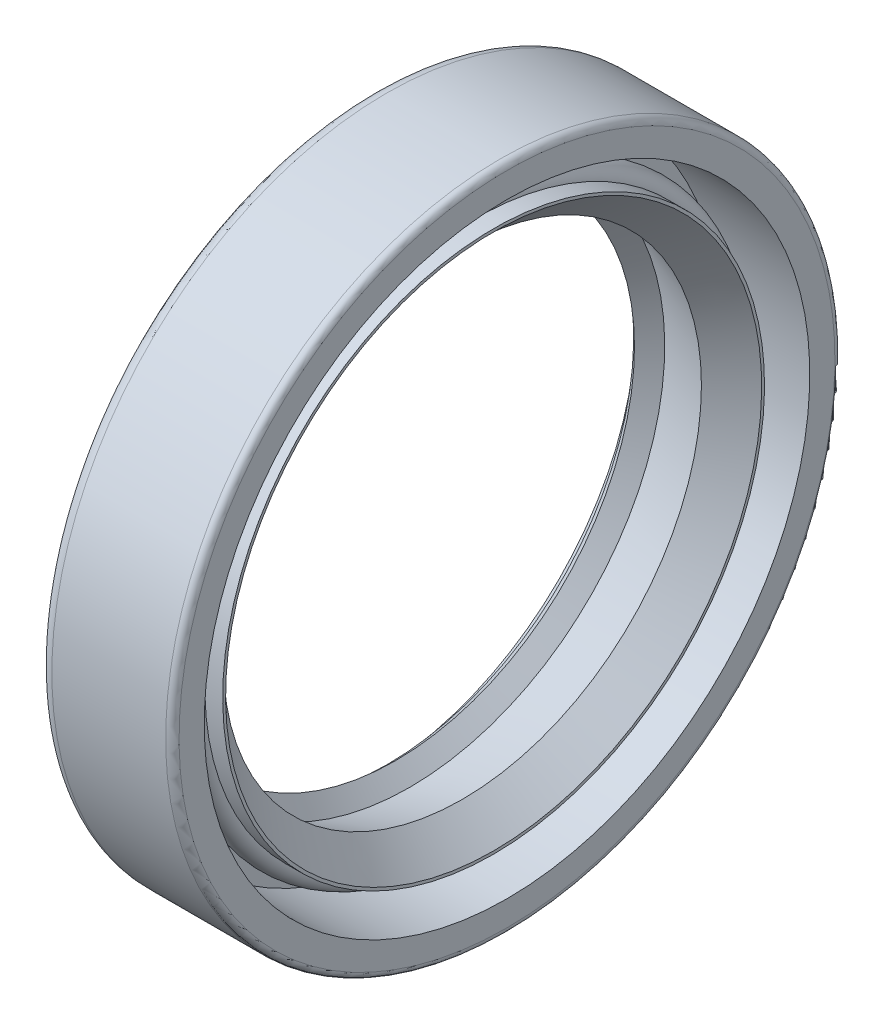
ISO-10303-21;
HEADER;
FILE_DESCRIPTION(('STEP AP214'),'2;1');
FILE_NAME('part.step','',(''),(''),'','','');
FILE_SCHEMA(('AUTOMOTIVE_DESIGN { 1 0 10303 214 1 1 1 1 }'));
ENDSEC;
DATA;
#1=APPLICATION_CONTEXT('core data for automotive mechanical design processes');
#2=APPLICATION_PROTOCOL_DEFINITION('international standard','automotive_design',2000,#1);
#3=PRODUCT_CONTEXT('',#1,'mechanical');
#4=PRODUCT('Part','Part','',(#3));
#5=PRODUCT_RELATED_PRODUCT_CATEGORY('part','',(#4));
#6=PRODUCT_DEFINITION_FORMATION('','',#4);
#7=PRODUCT_DEFINITION_CONTEXT('part definition',#1,'design');
#8=PRODUCT_DEFINITION('design','',#6,#7);
#9=PRODUCT_DEFINITION_SHAPE('','',#8);
#10=(LENGTH_UNIT() NAMED_UNIT(*) SI_UNIT(.MILLI.,.METRE.));
#11=(NAMED_UNIT(*) PLANE_ANGLE_UNIT() SI_UNIT($,.RADIAN.));
#12=(NAMED_UNIT(*) SI_UNIT($,.STERADIAN.) SOLID_ANGLE_UNIT());
#13=UNCERTAINTY_MEASURE_WITH_UNIT(LENGTH_MEASURE(1.E-05),#10,'distance_accuracy_value','');
#14=(GEOMETRIC_REPRESENTATION_CONTEXT(3) GLOBAL_UNCERTAINTY_ASSIGNED_CONTEXT((#13)) GLOBAL_UNIT_ASSIGNED_CONTEXT((#10,
#11,#12)) REPRESENTATION_CONTEXT('',''));
#15=CARTESIAN_POINT('',(0.,0.,0.));
#16=DIRECTION('',(0.,0.,1.));
#17=DIRECTION('',(1.,0.,0.));
#18=AXIS2_PLACEMENT_3D('',#15,#16,#17);
#19=CARTESIAN_POINT('',(4.66666666666667,0.,0.));
#20=DIRECTION('',(-1.,0.,0.));
#21=DIRECTION('',(0.,0.,1.));
#22=AXIS2_PLACEMENT_3D('',#19,#20,#21);
#23=TOROIDAL_SURFACE('',#22,14.1666666666667,0.7);
#24=CARTESIAN_POINT('',(4.66666666666667,0.,14.8666666666667));
#25=VERTEX_POINT('',#24);
#26=VERTEX_LOOP('',#25);
#27=FACE_BOUND('',#26,.T.);
#28=ADVANCED_FACE('F36',(#27),#23,.T.);
#29=CLOSED_SHELL('',(#28));
#30=MANIFOLD_SOLID_BREP('B2',#29);
#31=CARTESIAN_POINT('',(0.,16.8,0.));
#32=DIRECTION('',(1.,0.,0.));
#33=DIRECTION('',(0.,1.,0.));
#34=AXIS2_PLACEMENT_3D('',#31,#32,#33);
#35=PLANE('',#34);
#36=CARTESIAN_POINT('',(0.,0.,0.));
#37=DIRECTION('',(-1.,0.,0.));
#38=DIRECTION('',(0.,-1.,0.));
#39=AXIS2_PLACEMENT_3D('',#36,#37,#38);
#40=CIRCLE('',#39,15.8333333333333);
#41=CARTESIAN_POINT('',(0.,-15.8333333333333,0.));
#42=VERTEX_POINT('',#41);
#43=EDGE_CURVE('E35',#42,#42,#40,.T.);
#44=ORIENTED_EDGE('',*,*,#43,.F.);
#45=EDGE_LOOP('',(#44));
#46=FACE_BOUND('',#45,.T.);
#47=CARTESIAN_POINT('',(0.,0.,0.));
#48=DIRECTION('',(-1.,0.,0.));
#49=DIRECTION('',(0.,-1.,0.));
#50=AXIS2_PLACEMENT_3D('',#47,#48,#49);
#51=CIRCLE('',#50,16.8);
#52=CARTESIAN_POINT('',(0.,-16.8,0.));
#53=VERTEX_POINT('',#52);
#54=EDGE_CURVE('E118',#53,#53,#51,.T.);
#55=ORIENTED_EDGE('',*,*,#54,.T.);
#56=EDGE_LOOP('',(#55));
#57=FACE_BOUND('',#56,.T.);
#58=ADVANCED_FACE('F48',(#46,#57),#35,.F.);
#59=CARTESIAN_POINT('',(7.,0.,0.));
#60=DIRECTION('',(-1.,0.,0.));
#61=DIRECTION('',(0.,-1.,0.));
#62=AXIS2_PLACEMENT_3D('',#59,#60,#61);
#63=CYLINDRICAL_SURFACE('',#62,15.8333333333333);
#64=CARTESIAN_POINT('',(0.21875,0.,0.));
#65=DIRECTION('',(-1.,0.,0.));
#66=DIRECTION('',(0.,-1.,0.));
#67=AXIS2_PLACEMENT_3D('',#64,#65,#66);
#68=CIRCLE('',#67,15.8333333333333);
#69=CARTESIAN_POINT('',(0.21875,-15.8333333333333,0.));
#70=VERTEX_POINT('',#69);
#71=EDGE_CURVE('E54',#70,#70,#68,.T.);
#72=ORIENTED_EDGE('',*,*,#71,.F.);
#73=EDGE_LOOP('',(#72));
#74=FACE_BOUND('',#73,.T.);
#75=ORIENTED_EDGE('',*,*,#43,.T.);
#76=EDGE_LOOP('',(#75));
#77=FACE_BOUND('',#76,.T.);
#78=ADVANCED_FACE('F239',(#74,#77),#63,.F.);
#79=CARTESIAN_POINT('',(0.21875,15.8333333333333,0.));
#80=DIRECTION('',(1.,0.,0.));
#81=DIRECTION('',(0.,1.,0.));
#82=AXIS2_PLACEMENT_3D('',#79,#80,#81);
#83=PLANE('',#82);
#84=CARTESIAN_POINT('',(0.21875,0.,0.));
#85=DIRECTION('',(-1.,0.,0.));
#86=DIRECTION('',(0.,-1.,0.));
#87=AXIS2_PLACEMENT_3D('',#84,#85,#86);
#88=CIRCLE('',#87,14.1666666666667);
#89=CARTESIAN_POINT('',(0.21875,-14.1666666666667,0.));
#90=VERTEX_POINT('',#89);
#91=EDGE_CURVE('E58',#90,#90,#88,.T.);
#92=ORIENTED_EDGE('',*,*,#91,.F.);
#93=EDGE_LOOP('',(#92));
#94=FACE_BOUND('',#93,.T.);
#95=ORIENTED_EDGE('',*,*,#71,.T.);
#96=EDGE_LOOP('',(#95));
#97=FACE_BOUND('',#96,.T.);
#98=ADVANCED_FACE('F234',(#94,#97),#83,.F.);
#99=CARTESIAN_POINT('',(7.,0.,0.));
#100=DIRECTION('',(-1.,0.,0.));
#101=DIRECTION('',(0.,-1.,0.));
#102=AXIS2_PLACEMENT_3D('',#99,#100,#101);
#103=CYLINDRICAL_SURFACE('',#102,14.1666666666667);
#104=CARTESIAN_POINT('',(0.,0.,0.));
#105=DIRECTION('',(-1.,0.,0.));
#106=DIRECTION('',(0.,-1.,0.));
#107=AXIS2_PLACEMENT_3D('',#104,#105,#106);
#108=CIRCLE('',#107,14.1666666666667);
#109=CARTESIAN_POINT('',(0.,-14.1666666666667,0.));
#110=VERTEX_POINT('',#109);
#111=EDGE_CURVE('E62',#110,#110,#108,.T.);
#112=ORIENTED_EDGE('',*,*,#111,.F.);
#113=EDGE_LOOP('',(#112));
#114=FACE_BOUND('',#113,.T.);
#115=ORIENTED_EDGE('',*,*,#91,.T.);
#116=EDGE_LOOP('',(#115));
#117=FACE_BOUND('',#116,.T.);
#118=ADVANCED_FACE('F228',(#114,#117),#103,.T.);
#119=CARTESIAN_POINT('',(0.,14.1666666666667,0.));
#120=DIRECTION('',(1.,0.,0.));
#121=DIRECTION('',(0.,1.,0.));
#122=AXIS2_PLACEMENT_3D('',#119,#120,#121);
#123=PLANE('',#122);
#124=CARTESIAN_POINT('',(0.,0.,0.));
#125=DIRECTION('',(-1.,0.,0.));
#126=DIRECTION('',(0.,-1.,0.));
#127=AXIS2_PLACEMENT_3D('',#124,#125,#126);
#128=CIRCLE('',#127,13.75);
#129=CARTESIAN_POINT('',(0.,-13.75,0.));
#130=VERTEX_POINT('',#129);
#131=EDGE_CURVE('E67',#130,#130,#128,.T.);
#132=ORIENTED_EDGE('',*,*,#131,.F.);
#133=EDGE_LOOP('',(#132));
#134=FACE_BOUND('',#133,.T.);
#135=ORIENTED_EDGE('',*,*,#111,.T.);
#136=EDGE_LOOP('',(#135));
#137=FACE_BOUND('',#136,.T.);
#138=ADVANCED_FACE('F222',(#134,#137),#123,.F.);
#139=CARTESIAN_POINT('',(0.,0.,0.));
#140=DIRECTION('',(-1.,0.,0.));
#141=DIRECTION('',(0.,-1.,0.));
#142=AXIS2_PLACEMENT_3D('',#139,#140,#141);
#143=CONICAL_SURFACE('',#142,13.75,0.343023940420703);
#144=CARTESIAN_POINT('',(1.16666666666667,0.,0.));
#145=DIRECTION('',(-1.,0.,0.));
#146=DIRECTION('',(0.,-1.,0.));
#147=AXIS2_PLACEMENT_3D('',#144,#145,#146);
#148=CIRCLE('',#147,13.3333333333333);
#149=CARTESIAN_POINT('',(1.16666666666667,-13.3333333333333,0.));
#150=VERTEX_POINT('',#149);
#151=EDGE_CURVE('E70',#150,#150,#148,.T.);
#152=ORIENTED_EDGE('',*,*,#151,.F.);
#153=EDGE_LOOP('',(#152));
#154=FACE_BOUND('',#153,.T.);
#155=ORIENTED_EDGE('',*,*,#131,.T.);
#156=EDGE_LOOP('',(#155));
#157=FACE_BOUND('',#156,.T.);
#158=ADVANCED_FACE('F216',(#154,#157),#143,.F.);
#159=CARTESIAN_POINT('',(1.16666666666667,0.,0.));
#160=DIRECTION('',(1.,0.,0.));
#161=DIRECTION('',(0.,1.,0.));
#162=AXIS2_PLACEMENT_3D('',#159,#160,#161);
#163=CONICAL_SURFACE('',#162,13.3333333333333,0.840024322251901);
#164=CARTESIAN_POINT('',(0.752484208576877,0.,0.));
#165=DIRECTION('',(-1.,0.,0.));
#166=DIRECTION('',(0.,-1.,0.));
#167=AXIS2_PLACEMENT_3D('',#164,#165,#166);
#168=CIRCLE('',#167,12.8712353721462);
#169=CARTESIAN_POINT('',(0.752484208576877,-12.8712353721462,0.));
#170=VERTEX_POINT('',#169);
#171=EDGE_CURVE('E73',#170,#170,#168,.T.);
#172=ORIENTED_EDGE('',*,*,#171,.F.);
#173=EDGE_LOOP('',(#172));
#174=FACE_BOUND('',#173,.T.);
#175=ORIENTED_EDGE('',*,*,#151,.T.);
#176=EDGE_LOOP('',(#175));
#177=FACE_BOUND('',#176,.T.);
#178=ADVANCED_FACE('F210',(#174,#177),#163,.T.);
#179=CARTESIAN_POINT('',(0.752484208576877,0.,0.));
#180=DIRECTION('',(-1.,0.,0.));
#181=DIRECTION('',(0.,-1.,0.));
#182=AXIS2_PLACEMENT_3D('',#179,#180,#181);
#183=CONICAL_SURFACE('',#182,12.8712353721462,0.730772004542997);
#184=CARTESIAN_POINT('',(1.16666666666667,0.,0.));
#185=DIRECTION('',(-1.,0.,0.));
#186=DIRECTION('',(0.,-1.,0.));
#187=AXIS2_PLACEMENT_3D('',#184,#185,#186);
#188=CIRCLE('',#187,12.5);
#189=CARTESIAN_POINT('',(1.16666666666667,-12.5,0.));
#190=VERTEX_POINT('',#189);
#191=EDGE_CURVE('E76',#190,#190,#188,.T.);
#192=ORIENTED_EDGE('',*,*,#191,.F.);
#193=EDGE_LOOP('',(#192));
#194=FACE_BOUND('',#193,.T.);
#195=ORIENTED_EDGE('',*,*,#171,.T.);
#196=EDGE_LOOP('',(#195));
#197=FACE_BOUND('',#196,.T.);
#198=ADVANCED_FACE('F204',(#194,#197),#183,.F.);
#199=CARTESIAN_POINT('',(1.16666666666667,0.,0.));
#200=DIRECTION('',(1.,0.,0.));
#201=DIRECTION('',(0.,1.,0.));
#202=AXIS2_PLACEMENT_3D('',#199,#200,#201);
#203=CONICAL_SURFACE('',#202,12.5,0.840024322251901);
#204=CARTESIAN_POINT('',(1.91359064685784,0.,0.));
#205=DIRECTION('',(-1.,0.,0.));
#206=DIRECTION('',(0.,-1.,0.));
#207=AXIS2_PLACEMENT_3D('',#204,#205,#206);
#208=CIRCLE('',#207,13.3333333333333);
#209=CARTESIAN_POINT('',(1.91359064685784,-13.3333333333333,0.));
#210=VERTEX_POINT('',#209);
#211=EDGE_CURVE('E79',#210,#210,#208,.T.);
#212=ORIENTED_EDGE('',*,*,#211,.F.);
#213=EDGE_LOOP('',(#212));
#214=FACE_BOUND('',#213,.T.);
#215=ORIENTED_EDGE('',*,*,#191,.T.);
#216=EDGE_LOOP('',(#215));
#217=FACE_BOUND('',#216,.T.);
#218=ADVANCED_FACE('F198',(#214,#217),#203,.F.);
#219=CARTESIAN_POINT('',(1.91359064685784,0.,0.));
#220=DIRECTION('',(-1.,0.,0.));
#221=DIRECTION('',(0.,-1.,0.));
#222=AXIS2_PLACEMENT_3D('',#219,#220,#221);
#223=CONICAL_SURFACE('',#222,13.3333333333333,0.293924435090451);
#224=CARTESIAN_POINT('',(4.66666666666667,0.,0.));
#225=DIRECTION('',(-1.,0.,0.));
#226=DIRECTION('',(0.,-1.,0.));
#227=AXIS2_PLACEMENT_3D('',#224,#225,#226);
#228=CIRCLE('',#227,12.5);
#229=CARTESIAN_POINT('',(4.66666666666667,-12.5,0.));
#230=VERTEX_POINT('',#229);
#231=EDGE_CURVE('E82',#230,#230,#228,.T.);
#232=ORIENTED_EDGE('',*,*,#231,.F.);
#233=EDGE_LOOP('',(#232));
#234=FACE_BOUND('',#233,.T.);
#235=ORIENTED_EDGE('',*,*,#211,.T.);
#236=EDGE_LOOP('',(#235));
#237=FACE_BOUND('',#236,.T.);
#238=ADVANCED_FACE('F192',(#234,#237),#223,.F.);
#239=CARTESIAN_POINT('',(4.66666666666667,0.,0.));
#240=DIRECTION('',(1.,0.,0.));
#241=DIRECTION('',(0.,1.,0.));
#242=AXIS2_PLACEMENT_3D('',#239,#240,#241);
#243=CONICAL_SURFACE('',#242,12.5,0.748378047523382);
#244=CARTESIAN_POINT('',(6.3,0.,0.));
#245=DIRECTION('',(-1.,0.,0.));
#246=DIRECTION('',(0.,-1.,0.));
#247=AXIS2_PLACEMENT_3D('',#244,#245,#246);
#248=CIRCLE('',#247,14.0166666666663);
#249=CARTESIAN_POINT('',(6.3,-14.0166666666663,0.));
#250=VERTEX_POINT('',#249);
#251=EDGE_CURVE('E85',#250,#250,#248,.T.);
#252=ORIENTED_EDGE('',*,*,#251,.F.);
#253=EDGE_LOOP('',(#252));
#254=FACE_BOUND('',#253,.T.);
#255=ORIENTED_EDGE('',*,*,#231,.T.);
#256=EDGE_LOOP('',(#255));
#257=FACE_BOUND('',#256,.T.);
#258=ADVANCED_FACE('F186',(#254,#257),#243,.F.);
#259=CARTESIAN_POINT('',(6.3,14.0166666666663,0.));
#260=DIRECTION('',(-1.,0.,0.));
#261=DIRECTION('',(0.,-1.,0.));
#262=AXIS2_PLACEMENT_3D('',#259,#260,#261);
#263=PLANE('',#262);
#264=CARTESIAN_POINT('',(6.3,0.,0.));
#265=DIRECTION('',(-1.,0.,0.));
#266=DIRECTION('',(0.,-1.,0.));
#267=AXIS2_PLACEMENT_3D('',#264,#265,#266);
#268=CIRCLE('',#267,14.1666666666667);
#269=CARTESIAN_POINT('',(6.3,-14.1666666666667,0.));
#270=VERTEX_POINT('',#269);
#271=EDGE_CURVE('E88',#270,#270,#268,.T.);
#272=ORIENTED_EDGE('',*,*,#271,.F.);
#273=EDGE_LOOP('',(#272));
#274=FACE_BOUND('',#273,.T.);
#275=ORIENTED_EDGE('',*,*,#251,.T.);
#276=EDGE_LOOP('',(#275));
#277=FACE_BOUND('',#276,.T.);
#278=ADVANCED_FACE('F180',(#274,#277),#263,.F.);
#279=CARTESIAN_POINT('',(7.,0.,0.));
#280=DIRECTION('',(-1.,0.,0.));
#281=DIRECTION('',(0.,-1.,0.));
#282=AXIS2_PLACEMENT_3D('',#279,#280,#281);
#283=CYLINDRICAL_SURFACE('',#282,14.1666666666667);
#284=CARTESIAN_POINT('',(5.36666666666667,0.,0.));
#285=DIRECTION('',(-1.,0.,0.));
#286=DIRECTION('',(0.,-1.,0.));
#287=AXIS2_PLACEMENT_3D('',#284,#285,#286);
#288=CIRCLE('',#287,14.1666666666667);
#289=CARTESIAN_POINT('',(5.36666666666667,-14.1666666666667,0.));
#290=VERTEX_POINT('',#289);
#291=EDGE_CURVE('E91',#290,#290,#288,.T.);
#292=ORIENTED_EDGE('',*,*,#291,.F.);
#293=EDGE_LOOP('',(#292));
#294=FACE_BOUND('',#293,.T.);
#295=ORIENTED_EDGE('',*,*,#271,.T.);
#296=EDGE_LOOP('',(#295));
#297=FACE_BOUND('',#296,.T.);
#298=ADVANCED_FACE('F174',(#294,#297),#283,.T.);
#299=CARTESIAN_POINT('',(4.66666666666667,0.,0.));
#300=DIRECTION('',(-1.,0.,0.));
#301=DIRECTION('',(0.,-1.,0.));
#302=AXIS2_PLACEMENT_3D('',#299,#300,#301);
#303=TOROIDAL_SURFACE('',#302,14.1666666666667,0.7);
#304=CARTESIAN_POINT('',(3.96666666666667,0.,0.));
#305=DIRECTION('',(-1.,0.,0.));
#306=DIRECTION('',(0.,-1.,0.));
#307=AXIS2_PLACEMENT_3D('',#304,#305,#306);
#308=CIRCLE('',#307,14.1666666666667);
#309=CARTESIAN_POINT('',(3.96666666666667,-14.1666666666667,0.));
#310=VERTEX_POINT('',#309);
#311=EDGE_CURVE('E94',#310,#310,#308,.T.);
#312=ORIENTED_EDGE('',*,*,#311,.F.);
#313=EDGE_LOOP('',(#312));
#314=FACE_BOUND('',#313,.T.);
#315=ORIENTED_EDGE('',*,*,#291,.T.);
#316=EDGE_LOOP('',(#315));
#317=FACE_BOUND('',#316,.T.);
#318=ADVANCED_FACE('F168',(#314,#317),#303,.F.);
#319=CARTESIAN_POINT('',(7.,0.,0.));
#320=DIRECTION('',(-1.,0.,0.));
#321=DIRECTION('',(0.,-1.,0.));
#322=AXIS2_PLACEMENT_3D('',#319,#320,#321);
#323=CYLINDRICAL_SURFACE('',#322,14.1666666666667);
#324=CARTESIAN_POINT('',(2.68333333333333,0.,0.));
#325=DIRECTION('',(-1.,0.,0.));
#326=DIRECTION('',(0.,-1.,0.));
#327=AXIS2_PLACEMENT_3D('',#324,#325,#326);
#328=CIRCLE('',#327,14.1666666666667);
#329=CARTESIAN_POINT('',(2.68333333333333,-14.1666666666667,0.));
#330=VERTEX_POINT('',#329);
#331=EDGE_CURVE('E97',#330,#330,#328,.T.);
#332=ORIENTED_EDGE('',*,*,#331,.F.);
#333=EDGE_LOOP('',(#332));
#334=FACE_BOUND('',#333,.T.);
#335=ORIENTED_EDGE('',*,*,#311,.T.);
#336=EDGE_LOOP('',(#335));
#337=FACE_BOUND('',#336,.T.);
#338=ADVANCED_FACE('F162',(#334,#337),#323,.T.);
#339=CARTESIAN_POINT('',(2.68333333333333,0.,0.));
#340=DIRECTION('',(-1.,0.,0.));
#341=DIRECTION('',(0.,-1.,0.));
#342=AXIS2_PLACEMENT_3D('',#339,#340,#341);
#343=TOROIDAL_SURFACE('',#342,14.5166666666667,0.35);
#344=CARTESIAN_POINT('',(2.33333333333333,0.,0.));
#345=DIRECTION('',(-1.,0.,0.));
#346=DIRECTION('',(0.,-1.,0.));
#347=AXIS2_PLACEMENT_3D('',#344,#345,#346);
#348=CIRCLE('',#347,14.5166666666667);
#349=CARTESIAN_POINT('',(2.33333333333333,-14.5166666666667,0.));
#350=VERTEX_POINT('',#349);
#351=EDGE_CURVE('E100',#350,#350,#348,.T.);
#352=ORIENTED_EDGE('',*,*,#351,.F.);
#353=EDGE_LOOP('',(#352));
#354=FACE_BOUND('',#353,.T.);
#355=ORIENTED_EDGE('',*,*,#331,.T.);
#356=EDGE_LOOP('',(#355));
#357=FACE_BOUND('',#356,.T.);
#358=ADVANCED_FACE('F156',(#354,#357),#343,.F.);
#359=CARTESIAN_POINT('',(2.33333333333333,14.5166666666667,0.));
#360=DIRECTION('',(-1.,0.,0.));
#361=DIRECTION('',(0.,-1.,0.));
#362=AXIS2_PLACEMENT_3D('',#359,#360,#361);
#363=PLANE('',#362);
#364=CARTESIAN_POINT('',(2.33333333333333,0.,0.));
#365=DIRECTION('',(-1.,0.,0.));
#366=DIRECTION('',(0.,-1.,0.));
#367=AXIS2_PLACEMENT_3D('',#364,#365,#366);
#368=CIRCLE('',#367,15.8333333333333);
#369=CARTESIAN_POINT('',(2.33333333333333,-15.8333333333333,0.));
#370=VERTEX_POINT('',#369);
#371=EDGE_CURVE('E103',#370,#370,#368,.T.);
#372=ORIENTED_EDGE('',*,*,#371,.F.);
#373=EDGE_LOOP('',(#372));
#374=FACE_BOUND('',#373,.T.);
#375=ORIENTED_EDGE('',*,*,#351,.T.);
#376=EDGE_LOOP('',(#375));
#377=FACE_BOUND('',#376,.T.);
#378=ADVANCED_FACE('F150',(#374,#377),#363,.F.);
#379=CARTESIAN_POINT('',(7.,0.,0.));
#380=DIRECTION('',(-1.,0.,0.));
#381=DIRECTION('',(0.,-1.,0.));
#382=AXIS2_PLACEMENT_3D('',#379,#380,#381);
#383=CYLINDRICAL_SURFACE('',#382,15.8333333333333);
#384=CARTESIAN_POINT('',(7.,0.,0.));
#385=DIRECTION('',(-1.,0.,0.));
#386=DIRECTION('',(0.,-1.,0.));
#387=AXIS2_PLACEMENT_3D('',#384,#385,#386);
#388=CIRCLE('',#387,15.8333333333333);
#389=CARTESIAN_POINT('',(7.,-15.8333333333333,0.));
#390=VERTEX_POINT('',#389);
#391=EDGE_CURVE('E106',#390,#390,#388,.T.);
#392=ORIENTED_EDGE('',*,*,#391,.F.);
#393=EDGE_LOOP('',(#392));
#394=FACE_BOUND('',#393,.T.);
#395=ORIENTED_EDGE('',*,*,#371,.T.);
#396=EDGE_LOOP('',(#395));
#397=FACE_BOUND('',#396,.T.);
#398=ADVANCED_FACE('F144',(#394,#397),#383,.F.);
#399=CARTESIAN_POINT('',(7.,15.8333333333333,0.));
#400=DIRECTION('',(-1.,0.,0.));
#401=DIRECTION('',(0.,-1.,0.));
#402=AXIS2_PLACEMENT_3D('',#399,#400,#401);
#403=PLANE('',#402);
#404=CARTESIAN_POINT('',(7.,0.,0.));
#405=DIRECTION('',(-1.,0.,0.));
#406=DIRECTION('',(0.,-1.,0.));
#407=AXIS2_PLACEMENT_3D('',#404,#405,#406);
#408=CIRCLE('',#407,17.15);
#409=CARTESIAN_POINT('',(7.,-17.15,0.));
#410=VERTEX_POINT('',#409);
#411=EDGE_CURVE('E109',#410,#410,#408,.T.);
#412=ORIENTED_EDGE('',*,*,#411,.F.);
#413=EDGE_LOOP('',(#412));
#414=FACE_BOUND('',#413,.T.);
#415=ORIENTED_EDGE('',*,*,#391,.T.);
#416=EDGE_LOOP('',(#415));
#417=FACE_BOUND('',#416,.T.);
#418=ADVANCED_FACE('F138',(#414,#417),#403,.F.);
#419=CARTESIAN_POINT('',(6.65,0.,0.));
#420=DIRECTION('',(-1.,0.,0.));
#421=DIRECTION('',(0.,-1.,0.));
#422=AXIS2_PLACEMENT_3D('',#419,#420,#421);
#423=TOROIDAL_SURFACE('',#422,17.15,0.350000000000001);
#424=CARTESIAN_POINT('',(6.65,0.,0.));
#425=DIRECTION('',(-1.,0.,0.));
#426=DIRECTION('',(0.,-1.,0.));
#427=AXIS2_PLACEMENT_3D('',#424,#425,#426);
#428=CIRCLE('',#427,17.5);
#429=CARTESIAN_POINT('',(6.65,-17.5,0.));
#430=VERTEX_POINT('',#429);
#431=EDGE_CURVE('E112',#430,#430,#428,.T.);
#432=ORIENTED_EDGE('',*,*,#431,.F.);
#433=EDGE_LOOP('',(#432));
#434=FACE_BOUND('',#433,.T.);
#435=ORIENTED_EDGE('',*,*,#411,.T.);
#436=EDGE_LOOP('',(#435));
#437=FACE_BOUND('',#436,.T.);
#438=ADVANCED_FACE('F132',(#434,#437),#423,.T.);
#439=CARTESIAN_POINT('',(7.,0.,0.));
#440=DIRECTION('',(-1.,0.,0.));
#441=DIRECTION('',(0.,-1.,0.));
#442=AXIS2_PLACEMENT_3D('',#439,#440,#441);
#443=CYLINDRICAL_SURFACE('',#442,17.5);
#444=CARTESIAN_POINT('',(0.7,0.,0.));
#445=DIRECTION('',(-1.,0.,0.));
#446=DIRECTION('',(0.,-1.,0.));
#447=AXIS2_PLACEMENT_3D('',#444,#445,#446);
#448=CIRCLE('',#447,17.5);
#449=CARTESIAN_POINT('',(0.7,-17.5,0.));
#450=VERTEX_POINT('',#449);
#451=EDGE_CURVE('E115',#450,#450,#448,.T.);
#452=ORIENTED_EDGE('',*,*,#451,.F.);
#453=EDGE_LOOP('',(#452));
#454=FACE_BOUND('',#453,.T.);
#455=ORIENTED_EDGE('',*,*,#431,.T.);
#456=EDGE_LOOP('',(#455));
#457=FACE_BOUND('',#456,.T.);
#458=ADVANCED_FACE('F126',(#454,#457),#443,.T.);
#459=CARTESIAN_POINT('',(0.7,0.,0.));
#460=DIRECTION('',(-1.,0.,0.));
#461=DIRECTION('',(0.,-1.,0.));
#462=AXIS2_PLACEMENT_3D('',#459,#460,#461);
#463=TOROIDAL_SURFACE('',#462,16.8,0.700000000000001);
#464=ORIENTED_EDGE('',*,*,#54,.F.);
#465=EDGE_LOOP('',(#464));
#466=FACE_BOUND('',#465,.T.);
#467=ORIENTED_EDGE('',*,*,#451,.T.);
#468=EDGE_LOOP('',(#467));
#469=FACE_BOUND('',#468,.T.);
#470=ADVANCED_FACE('F123',(#466,#469),#463,.T.);
#471=CLOSED_SHELL('',(#58,#78,#98,#118,#138,#158,#178,#198,#218,#238,#258,#278,#298,#318,#338,
#358,#378,#398,#418,#438,#458,#470));
#472=MANIFOLD_SOLID_BREP('B6',#471);
#473=ADVANCED_BREP_SHAPE_REPRESENTATION('',(#18,#30,#472),#14);
#474=SHAPE_DEFINITION_REPRESENTATION(#9,#473);
ENDSEC;
END-ISO-10303-21;
